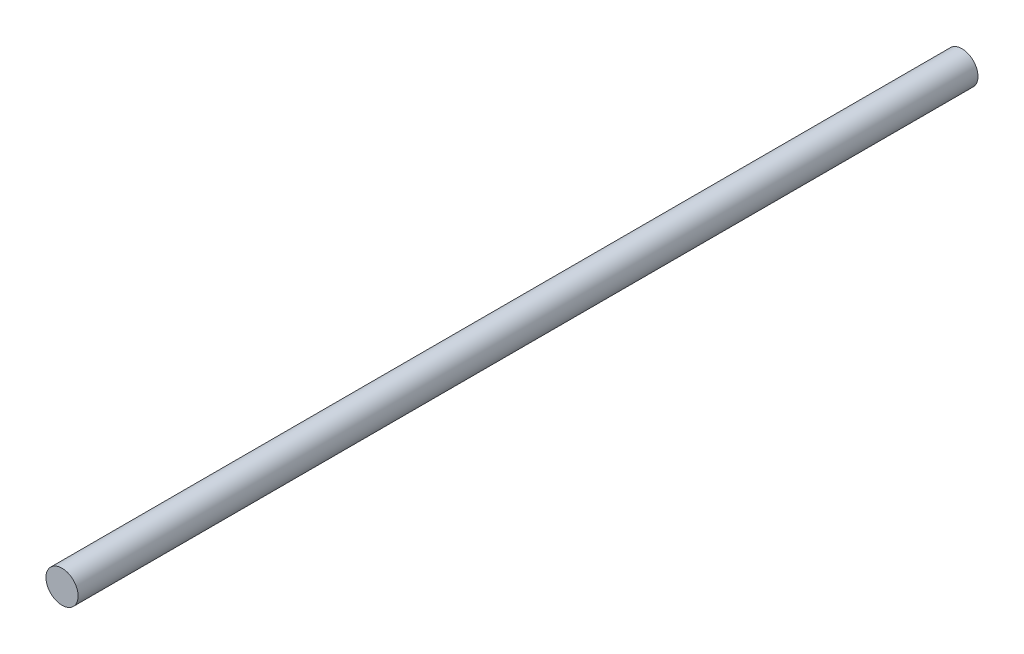
ISO-10303-21;
HEADER;
FILE_DESCRIPTION(('STEP AP214'),'2;1');
FILE_NAME('part.step','',(''),(''),'','','');
FILE_SCHEMA(('AUTOMOTIVE_DESIGN { 1 0 10303 214 1 1 1 1 }'));
ENDSEC;
DATA;
#1=APPLICATION_CONTEXT('core data for automotive mechanical design processes');
#2=APPLICATION_PROTOCOL_DEFINITION('international standard','automotive_design',2000,#1);
#3=PRODUCT_CONTEXT('',#1,'mechanical');
#4=PRODUCT('Part','Part','',(#3));
#5=PRODUCT_RELATED_PRODUCT_CATEGORY('part','',(#4));
#6=PRODUCT_DEFINITION_FORMATION('','',#4);
#7=PRODUCT_DEFINITION_CONTEXT('part definition',#1,'design');
#8=PRODUCT_DEFINITION('design','',#6,#7);
#9=PRODUCT_DEFINITION_SHAPE('','',#8);
#10=(LENGTH_UNIT() NAMED_UNIT(*) SI_UNIT(.MILLI.,.METRE.));
#11=(NAMED_UNIT(*) PLANE_ANGLE_UNIT() SI_UNIT($,.RADIAN.));
#12=(NAMED_UNIT(*) SI_UNIT($,.STERADIAN.) SOLID_ANGLE_UNIT());
#13=UNCERTAINTY_MEASURE_WITH_UNIT(LENGTH_MEASURE(1.E-05),#10,'distance_accuracy_value','');
#14=(GEOMETRIC_REPRESENTATION_CONTEXT(3) GLOBAL_UNCERTAINTY_ASSIGNED_CONTEXT((#13)) GLOBAL_UNIT_ASSIGNED_CONTEXT((#10,
#11,#12)) REPRESENTATION_CONTEXT('',''));
#15=CARTESIAN_POINT('',(0.,0.,0.));
#16=DIRECTION('',(0.,0.,1.));
#17=DIRECTION('',(1.,0.,0.));
#18=AXIS2_PLACEMENT_3D('',#15,#16,#17);
#19=CARTESIAN_POINT('',(0.,0.,177.8));
#20=DIRECTION('',(0.,0.,-1.));
#21=DIRECTION('',(-1.,0.,0.));
#22=AXIS2_PLACEMENT_3D('',#19,#20,#21);
#23=CYLINDRICAL_SURFACE('',#22,6.35);
#24=CARTESIAN_POINT('',(0.,0.,177.8));
#25=DIRECTION('',(0.,0.,1.));
#26=DIRECTION('',(1.,0.,0.));
#27=AXIS2_PLACEMENT_3D('',#24,#25,#26);
#28=CIRCLE('',#27,6.35);
#29=CARTESIAN_POINT('',(6.35,0.,177.8));
#30=VERTEX_POINT('',#29);
#31=EDGE_CURVE('E10',#30,#30,#28,.T.);
#32=ORIENTED_EDGE('',*,*,#31,.F.);
#33=EDGE_LOOP('',(#32));
#34=FACE_BOUND('',#33,.T.);
#35=CARTESIAN_POINT('',(0.,0.,-177.8));
#36=DIRECTION('',(0.,0.,1.));
#37=DIRECTION('',(1.,0.,0.));
#38=AXIS2_PLACEMENT_3D('',#35,#36,#37);
#39=CIRCLE('',#38,6.35);
#40=CARTESIAN_POINT('',(6.35,0.,-177.8));
#41=VERTEX_POINT('',#40);
#42=EDGE_CURVE('E34',#41,#41,#39,.T.);
#43=ORIENTED_EDGE('',*,*,#42,.T.);
#44=EDGE_LOOP('',(#43));
#45=FACE_BOUND('',#44,.T.);
#46=ADVANCED_FACE('F31',(#34,#45),#23,.T.);
#47=CARTESIAN_POINT('',(0.,0.,177.8));
#48=DIRECTION('',(0.,0.,1.));
#49=DIRECTION('',(1.,0.,0.));
#50=AXIS2_PLACEMENT_3D('',#47,#48,#49);
#51=PLANE('',#50);
#52=ORIENTED_EDGE('',*,*,#31,.T.);
#53=EDGE_LOOP('',(#52));
#54=FACE_BOUND('',#53,.T.);
#55=ADVANCED_FACE('F46',(#54),#51,.T.);
#56=CARTESIAN_POINT('',(0.,0.,-177.8));
#57=DIRECTION('',(0.,0.,1.));
#58=DIRECTION('',(1.,0.,0.));
#59=AXIS2_PLACEMENT_3D('',#56,#57,#58);
#60=PLANE('',#59);
#61=ORIENTED_EDGE('',*,*,#42,.F.);
#62=EDGE_LOOP('',(#61));
#63=FACE_BOUND('',#62,.T.);
#64=ADVANCED_FACE('F44',(#63),#60,.F.);
#65=CLOSED_SHELL('',(#46,#55,#64));
#66=MANIFOLD_SOLID_BREP('B2',#65);
#67=ADVANCED_BREP_SHAPE_REPRESENTATION('',(#18,#66),#14);
#68=SHAPE_DEFINITION_REPRESENTATION(#9,#67);
ENDSEC;
END-ISO-10303-21;
